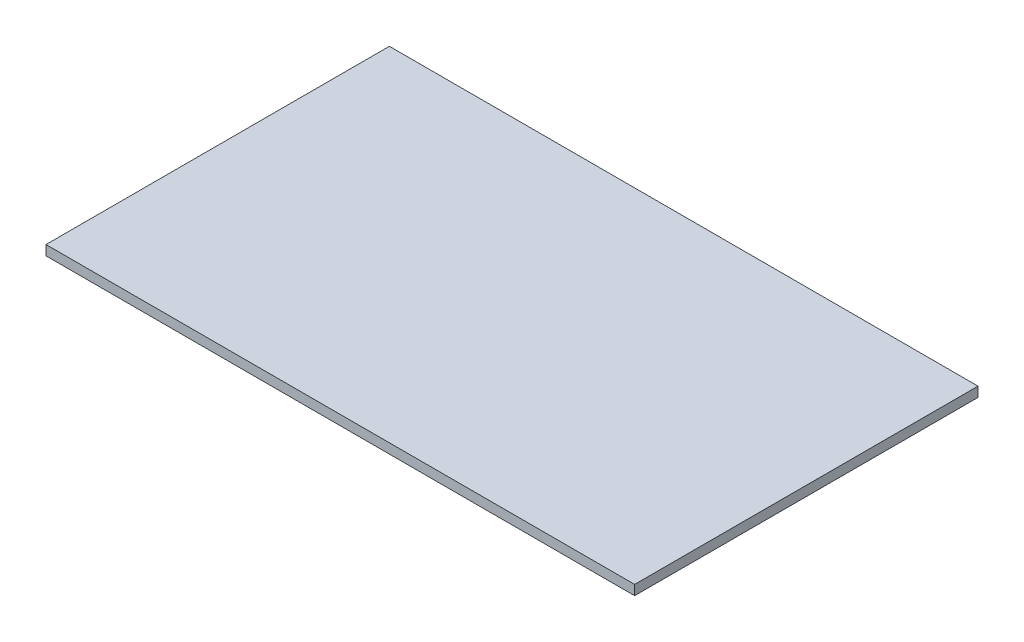
ISO-10303-21;
HEADER;
FILE_DESCRIPTION(('STEP AP214'),'2;1');
FILE_NAME('part.step','',(''),(''),'','','');
FILE_SCHEMA(('AUTOMOTIVE_DESIGN { 1 0 10303 214 1 1 1 1 }'));
ENDSEC;
DATA;
#1=APPLICATION_CONTEXT('core data for automotive mechanical design processes');
#2=APPLICATION_PROTOCOL_DEFINITION('international standard','automotive_design',2000,#1);
#3=PRODUCT_CONTEXT('',#1,'mechanical');
#4=PRODUCT('Part','Part','',(#3));
#5=PRODUCT_RELATED_PRODUCT_CATEGORY('part','',(#4));
#6=PRODUCT_DEFINITION_FORMATION('','',#4);
#7=PRODUCT_DEFINITION_CONTEXT('part definition',#1,'design');
#8=PRODUCT_DEFINITION('design','',#6,#7);
#9=PRODUCT_DEFINITION_SHAPE('','',#8);
#10=(LENGTH_UNIT() NAMED_UNIT(*) SI_UNIT(.MILLI.,.METRE.));
#11=(NAMED_UNIT(*) PLANE_ANGLE_UNIT() SI_UNIT($,.RADIAN.));
#12=(NAMED_UNIT(*) SI_UNIT($,.STERADIAN.) SOLID_ANGLE_UNIT());
#13=UNCERTAINTY_MEASURE_WITH_UNIT(LENGTH_MEASURE(1.E-05),#10,'distance_accuracy_value','');
#14=(GEOMETRIC_REPRESENTATION_CONTEXT(3) GLOBAL_UNCERTAINTY_ASSIGNED_CONTEXT((#13)) GLOBAL_UNIT_ASSIGNED_CONTEXT((#10,
#11,#12)) REPRESENTATION_CONTEXT('',''));
#15=CARTESIAN_POINT('',(0.,0.,0.));
#16=DIRECTION('',(0.,0.,1.));
#17=DIRECTION('',(1.,0.,0.));
#18=AXIS2_PLACEMENT_3D('',#15,#16,#17);
#19=CARTESIAN_POINT('',(300.,10.,-175.));
#20=DIRECTION('',(-1.,0.,0.));
#21=DIRECTION('',(0.,0.,1.));
#22=AXIS2_PLACEMENT_3D('',#19,#20,#21);
#23=PLANE('',#22);
#24=DIRECTION('',(0.,0.,-1.));
#25=VECTOR('',#24,1.);
#26=CARTESIAN_POINT('',(300.,0.,-175.));
#27=LINE('',#26,#25);
#28=CARTESIAN_POINT('',(300.,0.,175.));
#29=VERTEX_POINT('',#28);
#30=CARTESIAN_POINT('',(300.,0.,-175.));
#31=VERTEX_POINT('',#30);
#32=EDGE_CURVE('E96',#29,#31,#27,.T.);
#33=ORIENTED_EDGE('',*,*,#32,.T.);
#34=DIRECTION('',(0.,-1.,0.));
#35=VECTOR('',#34,1.);
#36=CARTESIAN_POINT('',(300.,10.,-175.));
#37=LINE('',#36,#35);
#38=CARTESIAN_POINT('',(300.,10.,-175.));
#39=VERTEX_POINT('',#38);
#40=EDGE_CURVE('E11',#39,#31,#37,.T.);
#41=ORIENTED_EDGE('',*,*,#40,.F.);
#42=DIRECTION('',(0.,0.,-1.));
#43=VECTOR('',#42,1.);
#44=CARTESIAN_POINT('',(300.,10.,-175.));
#45=LINE('',#44,#43);
#46=CARTESIAN_POINT('',(300.,10.,175.));
#47=VERTEX_POINT('',#46);
#48=EDGE_CURVE('E84',#47,#39,#45,.T.);
#49=ORIENTED_EDGE('',*,*,#48,.F.);
#50=DIRECTION('',(0.,-1.,0.));
#51=VECTOR('',#50,1.);
#52=CARTESIAN_POINT('',(300.,10.,175.));
#53=LINE('',#52,#51);
#54=EDGE_CURVE('E92',#47,#29,#53,.T.);
#55=ORIENTED_EDGE('',*,*,#54,.T.);
#56=EDGE_LOOP('',(#33,#41,#49,#55));
#57=FACE_BOUND('',#56,.T.);
#58=ADVANCED_FACE('F33',(#57),#23,.F.);
#59=CARTESIAN_POINT('',(-300.,10.,-175.));
#60=DIRECTION('',(0.,0.,1.));
#61=DIRECTION('',(1.,0.,0.));
#62=AXIS2_PLACEMENT_3D('',#59,#60,#61);
#63=PLANE('',#62);
#64=DIRECTION('',(-1.,0.,0.));
#65=VECTOR('',#64,1.);
#66=CARTESIAN_POINT('',(-300.,0.,-175.));
#67=LINE('',#66,#65);
#68=CARTESIAN_POINT('',(-300.,0.,-175.));
#69=VERTEX_POINT('',#68);
#70=EDGE_CURVE('E88',#31,#69,#67,.T.);
#71=ORIENTED_EDGE('',*,*,#70,.T.);
#72=DIRECTION('',(0.,-1.,0.));
#73=VECTOR('',#72,1.);
#74=CARTESIAN_POINT('',(-300.,10.,-175.));
#75=LINE('',#74,#73);
#76=CARTESIAN_POINT('',(-300.,10.,-175.));
#77=VERTEX_POINT('',#76);
#78=EDGE_CURVE('E41',#77,#69,#75,.T.);
#79=ORIENTED_EDGE('',*,*,#78,.F.);
#80=DIRECTION('',(-1.,0.,0.));
#81=VECTOR('',#80,1.);
#82=CARTESIAN_POINT('',(-300.,10.,-175.));
#83=LINE('',#82,#81);
#84=EDGE_CURVE('E79',#39,#77,#83,.T.);
#85=ORIENTED_EDGE('',*,*,#84,.F.);
#86=ORIENTED_EDGE('',*,*,#40,.T.);
#87=EDGE_LOOP('',(#71,#79,#85,#86));
#88=FACE_BOUND('',#87,.T.);
#89=ADVANCED_FACE('F87',(#88),#63,.F.);
#90=CARTESIAN_POINT('',(-300.,10.,-175.));
#91=DIRECTION('',(1.,0.,0.));
#92=DIRECTION('',(0.,0.,-1.));
#93=AXIS2_PLACEMENT_3D('',#90,#91,#92);
#94=PLANE('',#93);
#95=DIRECTION('',(0.,0.,1.));
#96=VECTOR('',#95,1.);
#97=CARTESIAN_POINT('',(-300.,0.,-175.));
#98=LINE('',#97,#96);
#99=CARTESIAN_POINT('',(-300.,0.,175.));
#100=VERTEX_POINT('',#99);
#101=EDGE_CURVE('E66',#69,#100,#98,.T.);
#102=ORIENTED_EDGE('',*,*,#101,.T.);
#103=DIRECTION('',(0.,-1.,0.));
#104=VECTOR('',#103,1.);
#105=CARTESIAN_POINT('',(-300.,10.,175.));
#106=LINE('',#105,#104);
#107=CARTESIAN_POINT('',(-300.,10.,175.));
#108=VERTEX_POINT('',#107);
#109=EDGE_CURVE('E89',#108,#100,#106,.T.);
#110=ORIENTED_EDGE('',*,*,#109,.F.);
#111=DIRECTION('',(0.,0.,1.));
#112=VECTOR('',#111,1.);
#113=CARTESIAN_POINT('',(-300.,10.,-175.));
#114=LINE('',#113,#112);
#115=EDGE_CURVE('E82',#77,#108,#114,.T.);
#116=ORIENTED_EDGE('',*,*,#115,.F.);
#117=ORIENTED_EDGE('',*,*,#78,.T.);
#118=EDGE_LOOP('',(#102,#110,#116,#117));
#119=FACE_BOUND('',#118,.T.);
#120=ADVANCED_FACE('F90',(#119),#94,.F.);
#121=CARTESIAN_POINT('',(-300.,10.,175.));
#122=DIRECTION('',(0.,0.,-1.));
#123=DIRECTION('',(-1.,0.,0.));
#124=AXIS2_PLACEMENT_3D('',#121,#122,#123);
#125=PLANE('',#124);
#126=DIRECTION('',(1.,0.,0.));
#127=VECTOR('',#126,1.);
#128=CARTESIAN_POINT('',(-300.,0.,175.));
#129=LINE('',#128,#127);
#130=EDGE_CURVE('E72',#100,#29,#129,.T.);
#131=ORIENTED_EDGE('',*,*,#130,.T.);
#132=ORIENTED_EDGE('',*,*,#54,.F.);
#133=DIRECTION('',(1.,0.,0.));
#134=VECTOR('',#133,1.);
#135=CARTESIAN_POINT('',(-300.,10.,175.));
#136=LINE('',#135,#134);
#137=EDGE_CURVE('E49',#108,#47,#136,.T.);
#138=ORIENTED_EDGE('',*,*,#137,.F.);
#139=ORIENTED_EDGE('',*,*,#109,.T.);
#140=EDGE_LOOP('',(#131,#132,#138,#139));
#141=FACE_BOUND('',#140,.T.);
#142=ADVANCED_FACE('F103',(#141),#125,.F.);
#143=CARTESIAN_POINT('',(0.,10.,0.));
#144=DIRECTION('',(0.,1.,0.));
#145=DIRECTION('',(0.,0.,1.));
#146=AXIS2_PLACEMENT_3D('',#143,#144,#145);
#147=PLANE('',#146);
#148=ORIENTED_EDGE('',*,*,#48,.T.);
#149=ORIENTED_EDGE('',*,*,#84,.T.);
#150=ORIENTED_EDGE('',*,*,#115,.T.);
#151=ORIENTED_EDGE('',*,*,#137,.T.);
#152=EDGE_LOOP('',(#148,#149,#150,#151));
#153=FACE_BOUND('',#152,.T.);
#154=ADVANCED_FACE('F80',(#153),#147,.T.);
#155=CARTESIAN_POINT('',(0.,0.,0.));
#156=DIRECTION('',(0.,1.,0.));
#157=DIRECTION('',(0.,0.,1.));
#158=AXIS2_PLACEMENT_3D('',#155,#156,#157);
#159=PLANE('',#158);
#160=ORIENTED_EDGE('',*,*,#32,.F.);
#161=ORIENTED_EDGE('',*,*,#130,.F.);
#162=ORIENTED_EDGE('',*,*,#101,.F.);
#163=ORIENTED_EDGE('',*,*,#70,.F.);
#164=EDGE_LOOP('',(#160,#161,#162,#163));
#165=FACE_BOUND('',#164,.T.);
#166=ADVANCED_FACE('F106',(#165),#159,.F.);
#167=CLOSED_SHELL('',(#58,#89,#120,#142,#154,#166));
#168=MANIFOLD_SOLID_BREP('B2',#167);
#169=ADVANCED_BREP_SHAPE_REPRESENTATION('',(#18,#168),#14);
#170=SHAPE_DEFINITION_REPRESENTATION(#9,#169);
ENDSEC;
END-ISO-10303-21;
